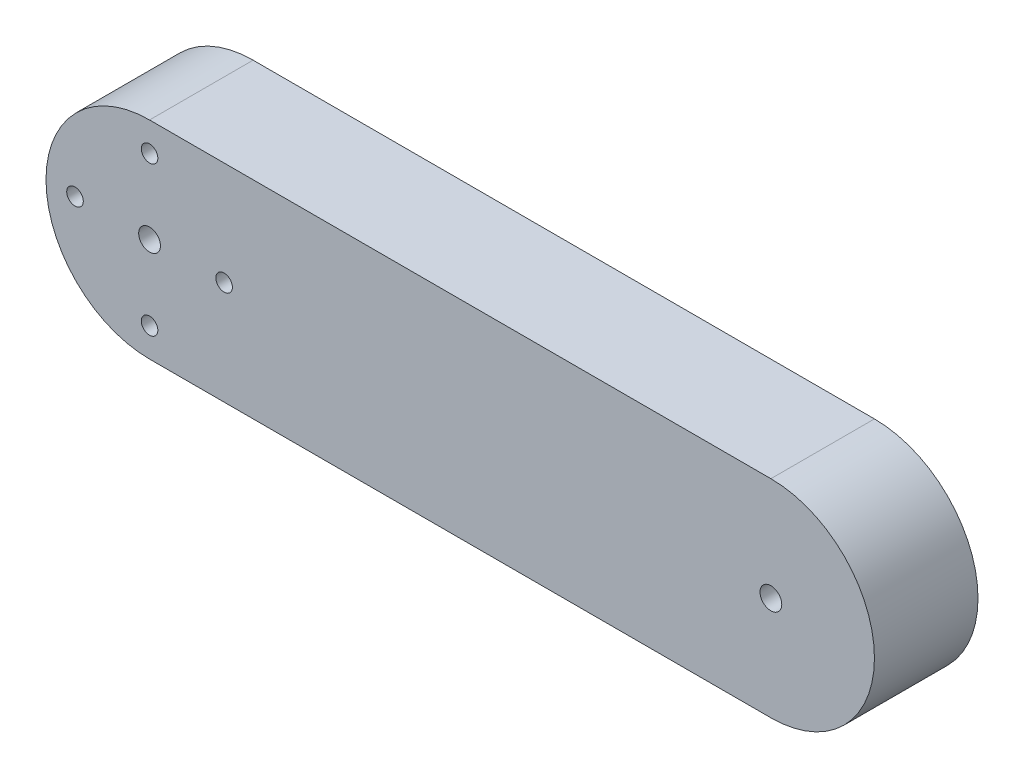
ISO-10303-21;
HEADER;
FILE_DESCRIPTION(('STEP AP214'),'2;1');
FILE_NAME('part.step','',(''),(''),'','','');
FILE_SCHEMA(('AUTOMOTIVE_DESIGN { 1 0 10303 214 1 1 1 1 }'));
ENDSEC;
DATA;
#1=APPLICATION_CONTEXT('core data for automotive mechanical design processes');
#2=APPLICATION_PROTOCOL_DEFINITION('international standard','automotive_design',2000,#1);
#3=PRODUCT_CONTEXT('',#1,'mechanical');
#4=PRODUCT('Part','Part','',(#3));
#5=PRODUCT_RELATED_PRODUCT_CATEGORY('part','',(#4));
#6=PRODUCT_DEFINITION_FORMATION('','',#4);
#7=PRODUCT_DEFINITION_CONTEXT('part definition',#1,'design');
#8=PRODUCT_DEFINITION('design','',#6,#7);
#9=PRODUCT_DEFINITION_SHAPE('','',#8);
#10=(LENGTH_UNIT() NAMED_UNIT(*) SI_UNIT(.MILLI.,.METRE.));
#11=(NAMED_UNIT(*) PLANE_ANGLE_UNIT() SI_UNIT($,.RADIAN.));
#12=(NAMED_UNIT(*) SI_UNIT($,.STERADIAN.) SOLID_ANGLE_UNIT());
#13=UNCERTAINTY_MEASURE_WITH_UNIT(LENGTH_MEASURE(1.E-05),#10,'distance_accuracy_value','');
#14=(GEOMETRIC_REPRESENTATION_CONTEXT(3) GLOBAL_UNCERTAINTY_ASSIGNED_CONTEXT((#13)) GLOBAL_UNIT_ASSIGNED_CONTEXT((#10,
#11,#12)) REPRESENTATION_CONTEXT('',''));
#15=CARTESIAN_POINT('',(0.,0.,0.));
#16=DIRECTION('',(0.,0.,1.));
#17=DIRECTION('',(1.,0.,0.));
#18=AXIS2_PLACEMENT_3D('',#15,#16,#17);
#19=CARTESIAN_POINT('',(-30.,0.,10.));
#20=DIRECTION('',(0.,0.,-1.));
#21=DIRECTION('',(-1.,0.,0.));
#22=AXIS2_PLACEMENT_3D('',#19,#20,#21);
#23=CYLINDRICAL_SURFACE('',#22,10.);
#24=CARTESIAN_POINT('',(-30.,0.,0.));
#25=DIRECTION('',(0.,0.,1.));
#26=DIRECTION('',(1.,0.,0.));
#27=AXIS2_PLACEMENT_3D('',#24,#25,#26);
#28=CIRCLE('',#27,10.);
#29=CARTESIAN_POINT('',(-30.,10.,0.));
#30=VERTEX_POINT('',#29);
#31=CARTESIAN_POINT('',(-30.,-10.,0.));
#32=VERTEX_POINT('',#31);
#33=EDGE_CURVE('E114',#30,#32,#28,.T.);
#34=ORIENTED_EDGE('',*,*,#33,.T.);
#35=DIRECTION('',(0.,0.,-1.));
#36=VECTOR('',#35,1.);
#37=CARTESIAN_POINT('',(-30.,-10.,10.));
#38=LINE('',#37,#36);
#39=CARTESIAN_POINT('',(-30.,-10.,10.));
#40=VERTEX_POINT('',#39);
#41=EDGE_CURVE('E11',#40,#32,#38,.T.);
#42=ORIENTED_EDGE('',*,*,#41,.F.);
#43=CARTESIAN_POINT('',(-30.,0.,10.));
#44=DIRECTION('',(0.,0.,1.));
#45=DIRECTION('',(1.,0.,0.));
#46=AXIS2_PLACEMENT_3D('',#43,#44,#45);
#47=CIRCLE('',#46,10.);
#48=CARTESIAN_POINT('',(-30.,10.,10.));
#49=VERTEX_POINT('',#48);
#50=EDGE_CURVE('E93',#49,#40,#47,.T.);
#51=ORIENTED_EDGE('',*,*,#50,.F.);
#52=DIRECTION('',(0.,0.,-1.));
#53=VECTOR('',#52,1.);
#54=CARTESIAN_POINT('',(-30.,10.,10.));
#55=LINE('',#54,#53);
#56=EDGE_CURVE('E60',#49,#30,#55,.T.);
#57=ORIENTED_EDGE('',*,*,#56,.T.);
#58=EDGE_LOOP('',(#34,#42,#51,#57));
#59=FACE_BOUND('',#58,.T.);
#60=ADVANCED_FACE('F43',(#59),#23,.T.);
#61=CARTESIAN_POINT('',(0.,-10.,10.));
#62=DIRECTION('',(0.,1.,0.));
#63=DIRECTION('',(0.,0.,1.));
#64=AXIS2_PLACEMENT_3D('',#61,#62,#63);
#65=PLANE('',#64);
#66=DIRECTION('',(1.,0.,0.));
#67=VECTOR('',#66,1.);
#68=CARTESIAN_POINT('',(0.,-10.,0.));
#69=LINE('',#68,#67);
#70=CARTESIAN_POINT('',(30.,-10.,0.));
#71=VERTEX_POINT('',#70);
#72=EDGE_CURVE('E98',#32,#71,#69,.T.);
#73=ORIENTED_EDGE('',*,*,#72,.T.);
#74=DIRECTION('',(0.,0.,-1.));
#75=VECTOR('',#74,1.);
#76=CARTESIAN_POINT('',(30.,-10.,10.));
#77=LINE('',#76,#75);
#78=CARTESIAN_POINT('',(30.,-10.,10.));
#79=VERTEX_POINT('',#78);
#80=EDGE_CURVE('E52',#79,#71,#77,.T.);
#81=ORIENTED_EDGE('',*,*,#80,.F.);
#82=DIRECTION('',(1.,0.,0.));
#83=VECTOR('',#82,1.);
#84=CARTESIAN_POINT('',(0.,-10.,10.));
#85=LINE('',#84,#83);
#86=EDGE_CURVE('E86',#40,#79,#85,.T.);
#87=ORIENTED_EDGE('',*,*,#86,.F.);
#88=ORIENTED_EDGE('',*,*,#41,.T.);
#89=EDGE_LOOP('',(#73,#81,#87,#88));
#90=FACE_BOUND('',#89,.T.);
#91=ADVANCED_FACE('F97',(#90),#65,.F.);
#92=CARTESIAN_POINT('',(30.,0.,10.));
#93=DIRECTION('',(0.,0.,-1.));
#94=DIRECTION('',(-1.,0.,0.));
#95=AXIS2_PLACEMENT_3D('',#92,#93,#94);
#96=CYLINDRICAL_SURFACE('',#95,10.);
#97=CARTESIAN_POINT('',(30.,0.,0.));
#98=DIRECTION('',(0.,0.,1.));
#99=DIRECTION('',(1.,0.,0.));
#100=AXIS2_PLACEMENT_3D('',#97,#98,#99);
#101=CIRCLE('',#100,10.);
#102=CARTESIAN_POINT('',(30.,10.,0.));
#103=VERTEX_POINT('',#102);
#104=EDGE_CURVE('E117',#71,#103,#101,.T.);
#105=ORIENTED_EDGE('',*,*,#104,.T.);
#106=DIRECTION('',(0.,0.,-1.));
#107=VECTOR('',#106,1.);
#108=CARTESIAN_POINT('',(30.,10.,10.));
#109=LINE('',#108,#107);
#110=CARTESIAN_POINT('',(30.,10.,10.));
#111=VERTEX_POINT('',#110);
#112=EDGE_CURVE('E75',#111,#103,#109,.T.);
#113=ORIENTED_EDGE('',*,*,#112,.F.);
#114=CARTESIAN_POINT('',(30.,0.,10.));
#115=DIRECTION('',(0.,0.,1.));
#116=DIRECTION('',(1.,0.,0.));
#117=AXIS2_PLACEMENT_3D('',#114,#115,#116);
#118=CIRCLE('',#117,10.);
#119=EDGE_CURVE('E92',#79,#111,#118,.T.);
#120=ORIENTED_EDGE('',*,*,#119,.F.);
#121=ORIENTED_EDGE('',*,*,#80,.T.);
#122=EDGE_LOOP('',(#105,#113,#120,#121));
#123=FACE_BOUND('',#122,.T.);
#124=ADVANCED_FACE('F101',(#123),#96,.T.);
#125=CARTESIAN_POINT('',(-30.,0.,10.));
#126=DIRECTION('',(0.,0.,-1.));
#127=DIRECTION('',(-1.,0.,0.));
#128=AXIS2_PLACEMENT_3D('',#125,#126,#127);
#129=CYLINDRICAL_SURFACE('',#128,1.05);
#130=CARTESIAN_POINT('',(-30.,0.,10.));
#131=DIRECTION('',(0.,0.,1.));
#132=DIRECTION('',(1.,0.,0.));
#133=AXIS2_PLACEMENT_3D('',#130,#131,#132);
#134=CIRCLE('',#133,1.05);
#135=CARTESIAN_POINT('',(-28.95,0.,10.));
#136=VERTEX_POINT('',#135);
#137=EDGE_CURVE('E126',#136,#136,#134,.T.);
#138=ORIENTED_EDGE('',*,*,#137,.T.);
#139=EDGE_LOOP('',(#138));
#140=FACE_BOUND('',#139,.T.);
#141=CARTESIAN_POINT('',(-30.,0.,0.));
#142=DIRECTION('',(0.,0.,1.));
#143=DIRECTION('',(1.,0.,0.));
#144=AXIS2_PLACEMENT_3D('',#141,#142,#143);
#145=CIRCLE('',#144,1.05);
#146=CARTESIAN_POINT('',(-28.95,0.,0.));
#147=VERTEX_POINT('',#146);
#148=EDGE_CURVE('E110',#147,#147,#145,.T.);
#149=ORIENTED_EDGE('',*,*,#148,.F.);
#150=EDGE_LOOP('',(#149));
#151=FACE_BOUND('',#150,.T.);
#152=ADVANCED_FACE('F173',(#140,#151),#129,.F.);
#153=CARTESIAN_POINT('',(30.,0.,10.));
#154=DIRECTION('',(0.,0.,-1.));
#155=DIRECTION('',(-1.,0.,0.));
#156=AXIS2_PLACEMENT_3D('',#153,#154,#155);
#157=CYLINDRICAL_SURFACE('',#156,1.05);
#158=CARTESIAN_POINT('',(30.,0.,10.));
#159=DIRECTION('',(0.,0.,1.));
#160=DIRECTION('',(1.,0.,0.));
#161=AXIS2_PLACEMENT_3D('',#158,#159,#160);
#162=CIRCLE('',#161,1.05);
#163=CARTESIAN_POINT('',(31.05,0.,10.));
#164=VERTEX_POINT('',#163);
#165=EDGE_CURVE('E122',#164,#164,#162,.T.);
#166=ORIENTED_EDGE('',*,*,#165,.T.);
#167=EDGE_LOOP('',(#166));
#168=FACE_BOUND('',#167,.T.);
#169=CARTESIAN_POINT('',(30.,0.,0.));
#170=DIRECTION('',(0.,0.,1.));
#171=DIRECTION('',(1.,0.,0.));
#172=AXIS2_PLACEMENT_3D('',#169,#170,#171);
#173=CIRCLE('',#172,1.05);
#174=CARTESIAN_POINT('',(31.05,0.,0.));
#175=VERTEX_POINT('',#174);
#176=EDGE_CURVE('E107',#175,#175,#173,.T.);
#177=ORIENTED_EDGE('',*,*,#176,.F.);
#178=EDGE_LOOP('',(#177));
#179=FACE_BOUND('',#178,.T.);
#180=ADVANCED_FACE('F45',(#168,#179),#157,.F.);
#181=CARTESIAN_POINT('',(0.,10.,10.));
#182=DIRECTION('',(0.,1.,0.));
#183=DIRECTION('',(0.,0.,1.));
#184=AXIS2_PLACEMENT_3D('',#181,#182,#183);
#185=PLANE('',#184);
#186=DIRECTION('',(1.,0.,0.));
#187=VECTOR('',#186,1.);
#188=CARTESIAN_POINT('',(0.,10.,0.));
#189=LINE('',#188,#187);
#190=EDGE_CURVE('E119',#30,#103,#189,.T.);
#191=ORIENTED_EDGE('',*,*,#190,.F.);
#192=ORIENTED_EDGE('',*,*,#56,.F.);
#193=DIRECTION('',(1.,0.,0.));
#194=VECTOR('',#193,1.);
#195=CARTESIAN_POINT('',(0.,10.,10.));
#196=LINE('',#195,#194);
#197=EDGE_CURVE('E102',#49,#111,#196,.T.);
#198=ORIENTED_EDGE('',*,*,#197,.T.);
#199=ORIENTED_EDGE('',*,*,#112,.T.);
#200=EDGE_LOOP('',(#191,#192,#198,#199));
#201=FACE_BOUND('',#200,.T.);
#202=ADVANCED_FACE('F162',(#201),#185,.T.);
#203=CARTESIAN_POINT('',(0.,0.,10.));
#204=DIRECTION('',(0.,0.,1.));
#205=DIRECTION('',(1.,0.,0.));
#206=AXIS2_PLACEMENT_3D('',#203,#204,#205);
#207=PLANE('',#206);
#208=CARTESIAN_POINT('',(-22.8,0.,10.));
#209=DIRECTION('',(0.,0.,1.));
#210=DIRECTION('',(1.,0.,0.));
#211=AXIS2_PLACEMENT_3D('',#208,#209,#210);
#212=CIRCLE('',#211,0.799999999999988);
#213=CARTESIAN_POINT('',(-22.,0.,10.));
#214=VERTEX_POINT('',#213);
#215=EDGE_CURVE('E153',#214,#214,#212,.T.);
#216=ORIENTED_EDGE('',*,*,#215,.F.);
#217=EDGE_LOOP('',(#216));
#218=FACE_BOUND('',#217,.T.);
#219=CARTESIAN_POINT('',(-30.,7.2,10.));
#220=DIRECTION('',(0.,0.,1.));
#221=DIRECTION('',(1.,0.,0.));
#222=AXIS2_PLACEMENT_3D('',#219,#220,#221);
#223=CIRCLE('',#222,0.799999999999999);
#224=CARTESIAN_POINT('',(-29.2,7.2,10.));
#225=VERTEX_POINT('',#224);
#226=EDGE_CURVE('E147',#225,#225,#223,.T.);
#227=ORIENTED_EDGE('',*,*,#226,.F.);
#228=EDGE_LOOP('',(#227));
#229=FACE_BOUND('',#228,.T.);
#230=CARTESIAN_POINT('',(-37.2,0.,10.));
#231=DIRECTION('',(0.,0.,1.));
#232=DIRECTION('',(1.,0.,0.));
#233=AXIS2_PLACEMENT_3D('',#230,#231,#232);
#234=CIRCLE('',#233,0.800000000000002);
#235=CARTESIAN_POINT('',(-36.4,0.,10.));
#236=VERTEX_POINT('',#235);
#237=EDGE_CURVE('E141',#236,#236,#234,.T.);
#238=ORIENTED_EDGE('',*,*,#237,.F.);
#239=EDGE_LOOP('',(#238));
#240=FACE_BOUND('',#239,.T.);
#241=CARTESIAN_POINT('',(-30.,-7.2,10.));
#242=DIRECTION('',(0.,0.,1.));
#243=DIRECTION('',(1.,0.,0.));
#244=AXIS2_PLACEMENT_3D('',#241,#242,#243);
#245=CIRCLE('',#244,0.799999999999999);
#246=CARTESIAN_POINT('',(-29.2,-7.2,10.));
#247=VERTEX_POINT('',#246);
#248=EDGE_CURVE('E135',#247,#247,#245,.T.);
#249=ORIENTED_EDGE('',*,*,#248,.F.);
#250=EDGE_LOOP('',(#249));
#251=FACE_BOUND('',#250,.T.);
#252=ORIENTED_EDGE('',*,*,#165,.F.);
#253=EDGE_LOOP('',(#252));
#254=FACE_BOUND('',#253,.T.);
#255=ORIENTED_EDGE('',*,*,#137,.F.);
#256=EDGE_LOOP('',(#255));
#257=FACE_BOUND('',#256,.T.);
#258=ORIENTED_EDGE('',*,*,#50,.T.);
#259=ORIENTED_EDGE('',*,*,#86,.T.);
#260=ORIENTED_EDGE('',*,*,#119,.T.);
#261=ORIENTED_EDGE('',*,*,#197,.F.);
#262=EDGE_LOOP('',(#258,#259,#260,#261));
#263=FACE_BOUND('',#262,.T.);
#264=ADVANCED_FACE('F89',(#218,#229,#240,#251,#254,#257,#263),#207,.T.);
#265=CARTESIAN_POINT('',(0.,0.,0.));
#266=DIRECTION('',(0.,0.,1.));
#267=DIRECTION('',(1.,0.,0.));
#268=AXIS2_PLACEMENT_3D('',#265,#266,#267);
#269=PLANE('',#268);
#270=CARTESIAN_POINT('',(-22.8,0.,0.));
#271=DIRECTION('',(0.,0.,1.));
#272=DIRECTION('',(1.,0.,0.));
#273=AXIS2_PLACEMENT_3D('',#270,#271,#272);
#274=CIRCLE('',#273,0.799999999999999);
#275=CARTESIAN_POINT('',(-22.,0.,0.));
#276=VERTEX_POINT('',#275);
#277=EDGE_CURVE('E150',#276,#276,#274,.T.);
#278=ORIENTED_EDGE('',*,*,#277,.T.);
#279=EDGE_LOOP('',(#278));
#280=FACE_BOUND('',#279,.T.);
#281=CARTESIAN_POINT('',(-30.,7.2,0.));
#282=DIRECTION('',(0.,0.,1.));
#283=DIRECTION('',(1.,0.,0.));
#284=AXIS2_PLACEMENT_3D('',#281,#282,#283);
#285=CIRCLE('',#284,0.799999999999999);
#286=CARTESIAN_POINT('',(-29.2,7.2,0.));
#287=VERTEX_POINT('',#286);
#288=EDGE_CURVE('E144',#287,#287,#285,.T.);
#289=ORIENTED_EDGE('',*,*,#288,.T.);
#290=EDGE_LOOP('',(#289));
#291=FACE_BOUND('',#290,.T.);
#292=CARTESIAN_POINT('',(-37.2,0.,0.));
#293=DIRECTION('',(0.,0.,1.));
#294=DIRECTION('',(1.,0.,0.));
#295=AXIS2_PLACEMENT_3D('',#292,#293,#294);
#296=CIRCLE('',#295,0.799999999999995);
#297=CARTESIAN_POINT('',(-36.4,0.,0.));
#298=VERTEX_POINT('',#297);
#299=EDGE_CURVE('E138',#298,#298,#296,.T.);
#300=ORIENTED_EDGE('',*,*,#299,.T.);
#301=EDGE_LOOP('',(#300));
#302=FACE_BOUND('',#301,.T.);
#303=CARTESIAN_POINT('',(-30.,-7.2,0.));
#304=DIRECTION('',(0.,0.,1.));
#305=DIRECTION('',(1.,0.,0.));
#306=AXIS2_PLACEMENT_3D('',#303,#304,#305);
#307=CIRCLE('',#306,0.799999999999999);
#308=CARTESIAN_POINT('',(-29.2,-7.2,0.));
#309=VERTEX_POINT('',#308);
#310=EDGE_CURVE('E111',#309,#309,#307,.T.);
#311=ORIENTED_EDGE('',*,*,#310,.T.);
#312=EDGE_LOOP('',(#311));
#313=FACE_BOUND('',#312,.T.);
#314=ORIENTED_EDGE('',*,*,#176,.T.);
#315=EDGE_LOOP('',(#314));
#316=FACE_BOUND('',#315,.T.);
#317=ORIENTED_EDGE('',*,*,#148,.T.);
#318=EDGE_LOOP('',(#317));
#319=FACE_BOUND('',#318,.T.);
#320=ORIENTED_EDGE('',*,*,#33,.F.);
#321=ORIENTED_EDGE('',*,*,#190,.T.);
#322=ORIENTED_EDGE('',*,*,#104,.F.);
#323=ORIENTED_EDGE('',*,*,#72,.F.);
#324=EDGE_LOOP('',(#320,#321,#322,#323));
#325=FACE_BOUND('',#324,.T.);
#326=ADVANCED_FACE('F161',(#280,#291,#302,#313,#316,#319,#325),#269,.F.);
#327=CARTESIAN_POINT('',(-30.,-7.2,10.));
#328=DIRECTION('',(0.,0.,1.));
#329=DIRECTION('',(1.,0.,0.));
#330=AXIS2_PLACEMENT_3D('',#327,#328,#329);
#331=CYLINDRICAL_SURFACE('',#330,0.799999999999999);
#332=ORIENTED_EDGE('',*,*,#310,.F.);
#333=EDGE_LOOP('',(#332));
#334=FACE_BOUND('',#333,.T.);
#335=ORIENTED_EDGE('',*,*,#248,.T.);
#336=EDGE_LOOP('',(#335));
#337=FACE_BOUND('',#336,.T.);
#338=ADVANCED_FACE('F179',(#334,#337),#331,.F.);
#339=CARTESIAN_POINT('',(-37.2,0.,10.));
#340=DIRECTION('',(0.,0.,1.));
#341=DIRECTION('',(1.,0.,0.));
#342=AXIS2_PLACEMENT_3D('',#339,#340,#341);
#343=CYLINDRICAL_SURFACE('',#342,0.799999999999999);
#344=ORIENTED_EDGE('',*,*,#299,.F.);
#345=EDGE_LOOP('',(#344));
#346=FACE_BOUND('',#345,.T.);
#347=ORIENTED_EDGE('',*,*,#237,.T.);
#348=EDGE_LOOP('',(#347));
#349=FACE_BOUND('',#348,.T.);
#350=ADVANCED_FACE('F224',(#346,#349),#343,.F.);
#351=CARTESIAN_POINT('',(-30.,7.2,10.));
#352=DIRECTION('',(0.,0.,1.));
#353=DIRECTION('',(1.,0.,0.));
#354=AXIS2_PLACEMENT_3D('',#351,#352,#353);
#355=CYLINDRICAL_SURFACE('',#354,0.799999999999999);
#356=ORIENTED_EDGE('',*,*,#288,.F.);
#357=EDGE_LOOP('',(#356));
#358=FACE_BOUND('',#357,.T.);
#359=ORIENTED_EDGE('',*,*,#226,.T.);
#360=EDGE_LOOP('',(#359));
#361=FACE_BOUND('',#360,.T.);
#362=ADVANCED_FACE('F238',(#358,#361),#355,.F.);
#363=CARTESIAN_POINT('',(-22.8,0.,10.));
#364=DIRECTION('',(0.,0.,1.));
#365=DIRECTION('',(1.,0.,0.));
#366=AXIS2_PLACEMENT_3D('',#363,#364,#365);
#367=CYLINDRICAL_SURFACE('',#366,0.799999999999993);
#368=ORIENTED_EDGE('',*,*,#277,.F.);
#369=EDGE_LOOP('',(#368));
#370=FACE_BOUND('',#369,.T.);
#371=ORIENTED_EDGE('',*,*,#215,.T.);
#372=EDGE_LOOP('',(#371));
#373=FACE_BOUND('',#372,.T.);
#374=ADVANCED_FACE('F157',(#370,#373),#367,.F.);
#375=CLOSED_SHELL('',(#60,#91,#124,#152,#180,#202,#264,#326,#338,#350,#362,#374));
#376=MANIFOLD_SOLID_BREP('B2',#375);
#377=ADVANCED_BREP_SHAPE_REPRESENTATION('',(#18,#376),#14);
#378=SHAPE_DEFINITION_REPRESENTATION(#9,#377);
ENDSEC;
END-ISO-10303-21;
